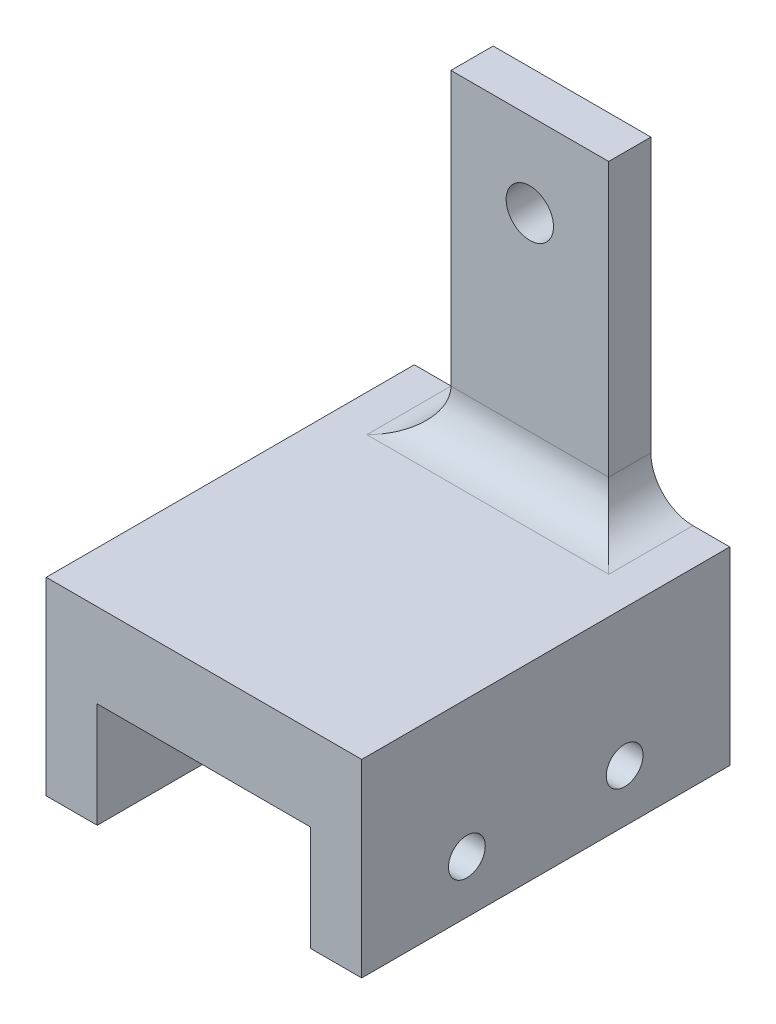
ISO-10303-21;
HEADER;
FILE_DESCRIPTION(('STEP AP214'),'2;1');
FILE_NAME('part.step','',(''),(''),'','','');
FILE_SCHEMA(('AUTOMOTIVE_DESIGN { 1 0 10303 214 1 1 1 1 }'));
ENDSEC;
DATA;
#1=APPLICATION_CONTEXT('core data for automotive mechanical design processes');
#2=APPLICATION_PROTOCOL_DEFINITION('international standard','automotive_design',2000,#1);
#3=PRODUCT_CONTEXT('',#1,'mechanical');
#4=PRODUCT('Part','Part','',(#3));
#5=PRODUCT_RELATED_PRODUCT_CATEGORY('part','',(#4));
#6=PRODUCT_DEFINITION_FORMATION('','',#4);
#7=PRODUCT_DEFINITION_CONTEXT('part definition',#1,'design');
#8=PRODUCT_DEFINITION('design','',#6,#7);
#9=PRODUCT_DEFINITION_SHAPE('','',#8);
#10=(LENGTH_UNIT() NAMED_UNIT(*) SI_UNIT(.MILLI.,.METRE.));
#11=(NAMED_UNIT(*) PLANE_ANGLE_UNIT() SI_UNIT($,.RADIAN.));
#12=(NAMED_UNIT(*) SI_UNIT($,.STERADIAN.) SOLID_ANGLE_UNIT());
#13=UNCERTAINTY_MEASURE_WITH_UNIT(LENGTH_MEASURE(1.E-05),#10,'distance_accuracy_value','');
#14=(GEOMETRIC_REPRESENTATION_CONTEXT(3) GLOBAL_UNCERTAINTY_ASSIGNED_CONTEXT((#13)) GLOBAL_UNIT_ASSIGNED_CONTEXT((#10,
#11,#12)) REPRESENTATION_CONTEXT('',''));
#15=CARTESIAN_POINT('',(0.,0.,0.));
#16=DIRECTION('',(0.,0.,1.));
#17=DIRECTION('',(1.,0.,0.));
#18=AXIS2_PLACEMENT_3D('',#15,#16,#17);
#19=CARTESIAN_POINT('',(0.,-15.,0.));
#20=DIRECTION('',(0.,-1.,0.));
#21=DIRECTION('',(0.,0.,-1.));
#22=AXIS2_PLACEMENT_3D('',#19,#20,#21);
#23=PLANE('',#22);
#24=DIRECTION('',(1.,0.,0.));
#25=VECTOR('',#24,1.);
#26=CARTESIAN_POINT('',(-15.,-15.,0.));
#27=LINE('',#26,#25);
#28=CARTESIAN_POINT('',(11.5,-15.,0.));
#29=VERTEX_POINT('',#28);
#30=CARTESIAN_POINT('',(15.,-15.,0.));
#31=VERTEX_POINT('',#30);
#32=EDGE_CURVE('E159',#29,#31,#27,.T.);
#33=ORIENTED_EDGE('',*,*,#32,.F.);
#34=DIRECTION('',(0.,0.,-1.));
#35=VECTOR('',#34,1.);
#36=CARTESIAN_POINT('',(11.5,-15.,4.01600419213466));
#37=LINE('',#36,#35);
#38=CARTESIAN_POINT('',(11.5,-15.,8.01600419213466));
#39=VERTEX_POINT('',#38);
#40=EDGE_CURVE('E231',#29,#39,#37,.F.);
#41=ORIENTED_EDGE('',*,*,#40,.T.);
#42=DIRECTION('',(1.,0.,0.));
#43=VECTOR('',#42,1.);
#44=CARTESIAN_POINT('',(-7.5,-15.,8.01600419213466));
#45=LINE('',#44,#43);
#46=CARTESIAN_POINT('',(-11.5,-15.,8.01600419213466));
#47=VERTEX_POINT('',#46);
#48=EDGE_CURVE('E227',#39,#47,#45,.F.);
#49=ORIENTED_EDGE('',*,*,#48,.T.);
#50=DIRECTION('',(0.,0.,1.));
#51=VECTOR('',#50,1.);
#52=CARTESIAN_POINT('',(-11.5,-15.,0.));
#53=LINE('',#52,#51);
#54=CARTESIAN_POINT('',(-11.5,-15.,0.));
#55=VERTEX_POINT('',#54);
#56=EDGE_CURVE('E229',#47,#55,#53,.F.);
#57=ORIENTED_EDGE('',*,*,#56,.T.);
#58=CARTESIAN_POINT('',(-15.,-15.,0.));
#59=VERTEX_POINT('',#58);
#60=EDGE_CURVE('E161',#59,#55,#27,.T.);
#61=ORIENTED_EDGE('',*,*,#60,.F.);
#62=DIRECTION('',(0.,0.,-1.));
#63=VECTOR('',#62,1.);
#64=CARTESIAN_POINT('',(-15.,-15.,0.));
#65=LINE('',#64,#63);
#66=CARTESIAN_POINT('',(-15.,-15.,35.));
#67=VERTEX_POINT('',#66);
#68=EDGE_CURVE('E209',#67,#59,#65,.T.);
#69=ORIENTED_EDGE('',*,*,#68,.F.);
#70=DIRECTION('',(-1.,0.,0.));
#71=VECTOR('',#70,1.);
#72=CARTESIAN_POINT('',(15.,-15.,35.));
#73=LINE('',#72,#71);
#74=CARTESIAN_POINT('',(15.,-15.,35.));
#75=VERTEX_POINT('',#74);
#76=EDGE_CURVE('E213',#75,#67,#73,.T.);
#77=ORIENTED_EDGE('',*,*,#76,.F.);
#78=DIRECTION('',(0.,0.,1.));
#79=VECTOR('',#78,1.);
#80=CARTESIAN_POINT('',(15.,-15.,0.));
#81=LINE('',#80,#79);
#82=EDGE_CURVE('E205',#31,#75,#81,.T.);
#83=ORIENTED_EDGE('',*,*,#82,.F.);
#84=EDGE_LOOP('',(#33,#41,#49,#57,#61,#69,#77,#83));
#85=FACE_BOUND('',#84,.T.);
#86=ADVANCED_FACE('F33',(#85),#23,.F.);
#87=CARTESIAN_POINT('',(0.,-23.,0.));
#88=DIRECTION('',(0.,-1.,0.));
#89=DIRECTION('',(0.,0.,-1.));
#90=AXIS2_PLACEMENT_3D('',#87,#88,#89);
#91=PLANE('',#90);
#92=DIRECTION('',(1.,0.,0.));
#93=VECTOR('',#92,1.);
#94=CARTESIAN_POINT('',(15.,-23.,0.));
#95=LINE('',#94,#93);
#96=CARTESIAN_POINT('',(-10.15,-23.,0.));
#97=VERTEX_POINT('',#96);
#98=CARTESIAN_POINT('',(10.15,-23.,0.));
#99=VERTEX_POINT('',#98);
#100=EDGE_CURVE('E208',#97,#99,#95,.T.);
#101=ORIENTED_EDGE('',*,*,#100,.T.);
#102=DIRECTION('',(0.,0.,-1.));
#103=VECTOR('',#102,1.);
#104=CARTESIAN_POINT('',(10.15,-23.,0.));
#105=LINE('',#104,#103);
#106=CARTESIAN_POINT('',(10.15,-23.,35.));
#107=VERTEX_POINT('',#106);
#108=EDGE_CURVE('E167',#107,#99,#105,.T.);
#109=ORIENTED_EDGE('',*,*,#108,.F.);
#110=DIRECTION('',(-1.,0.,0.));
#111=VECTOR('',#110,1.);
#112=CARTESIAN_POINT('',(15.,-23.,35.));
#113=LINE('',#112,#111);
#114=CARTESIAN_POINT('',(-10.15,-23.,35.));
#115=VERTEX_POINT('',#114);
#116=EDGE_CURVE('E206',#107,#115,#113,.T.);
#117=ORIENTED_EDGE('',*,*,#116,.T.);
#118=DIRECTION('',(0.,0.,1.));
#119=VECTOR('',#118,1.);
#120=CARTESIAN_POINT('',(-10.15,-23.,0.));
#121=LINE('',#120,#119);
#122=EDGE_CURVE('E186',#97,#115,#121,.T.);
#123=ORIENTED_EDGE('',*,*,#122,.F.);
#124=EDGE_LOOP('',(#101,#109,#117,#123));
#125=FACE_BOUND('',#124,.T.);
#126=ADVANCED_FACE('F317',(#125),#91,.T.);
#127=CARTESIAN_POINT('',(15.,-15.,7.));
#128=DIRECTION('',(-1.,0.,0.));
#129=DIRECTION('',(0.,0.,1.));
#130=AXIS2_PLACEMENT_3D('',#127,#128,#129);
#131=PLANE('',#130);
#132=CARTESIAN_POINT('',(15.,-28.,25.));
#133=DIRECTION('',(1.,0.,0.));
#134=DIRECTION('',(0.,0.,-1.));
#135=AXIS2_PLACEMENT_3D('',#132,#133,#134);
#136=CIRCLE('',#135,1.75);
#137=CARTESIAN_POINT('',(15.,-28.,23.25));
#138=VERTEX_POINT('',#137);
#139=EDGE_CURVE('E557',#138,#138,#136,.T.);
#140=ORIENTED_EDGE('',*,*,#139,.F.);
#141=EDGE_LOOP('',(#140));
#142=FACE_BOUND('',#141,.T.);
#143=CARTESIAN_POINT('',(15.,-28.,10.));
#144=DIRECTION('',(1.,0.,0.));
#145=DIRECTION('',(0.,0.,-1.));
#146=AXIS2_PLACEMENT_3D('',#143,#144,#145);
#147=CIRCLE('',#146,1.75);
#148=CARTESIAN_POINT('',(15.,-28.,8.25));
#149=VERTEX_POINT('',#148);
#150=EDGE_CURVE('E252',#149,#149,#147,.T.);
#151=ORIENTED_EDGE('',*,*,#150,.F.);
#152=EDGE_LOOP('',(#151));
#153=FACE_BOUND('',#152,.T.);
#154=DIRECTION('',(0.,1.,0.));
#155=VECTOR('',#154,1.);
#156=CARTESIAN_POINT('',(15.,-15.,0.));
#157=LINE('',#156,#155);
#158=CARTESIAN_POINT('',(15.,-33.,0.));
#159=VERTEX_POINT('',#158);
#160=EDGE_CURVE('E221',#159,#31,#157,.T.);
#161=ORIENTED_EDGE('',*,*,#160,.T.);
#162=ORIENTED_EDGE('',*,*,#82,.T.);
#163=DIRECTION('',(0.,1.,0.));
#164=VECTOR('',#163,1.);
#165=CARTESIAN_POINT('',(15.,-23.,35.));
#166=LINE('',#165,#164);
#167=CARTESIAN_POINT('',(15.,-33.,35.));
#168=VERTEX_POINT('',#167);
#169=EDGE_CURVE('E218',#168,#75,#166,.T.);
#170=ORIENTED_EDGE('',*,*,#169,.F.);
#171=DIRECTION('',(0.,0.,1.));
#172=VECTOR('',#171,1.);
#173=CARTESIAN_POINT('',(15.,-33.,0.));
#174=LINE('',#173,#172);
#175=EDGE_CURVE('E168',#159,#168,#174,.T.);
#176=ORIENTED_EDGE('',*,*,#175,.F.);
#177=EDGE_LOOP('',(#161,#162,#170,#176));
#178=FACE_BOUND('',#177,.T.);
#179=ADVANCED_FACE('F288',(#142,#153,#178),#131,.F.);
#180=CARTESIAN_POINT('',(-15.,-15.,7.));
#181=DIRECTION('',(1.,0.,0.));
#182=DIRECTION('',(0.,0.,-1.));
#183=AXIS2_PLACEMENT_3D('',#180,#181,#182);
#184=PLANE('',#183);
#185=CARTESIAN_POINT('',(-15.,-28.,25.));
#186=DIRECTION('',(1.,0.,0.));
#187=DIRECTION('',(0.,0.,-1.));
#188=AXIS2_PLACEMENT_3D('',#185,#186,#187);
#189=CIRCLE('',#188,1.75);
#190=CARTESIAN_POINT('',(-15.,-28.,23.25));
#191=VERTEX_POINT('',#190);
#192=EDGE_CURVE('E553',#191,#191,#189,.T.);
#193=ORIENTED_EDGE('',*,*,#192,.T.);
#194=EDGE_LOOP('',(#193));
#195=FACE_BOUND('',#194,.T.);
#196=CARTESIAN_POINT('',(-15.,-28.,10.));
#197=DIRECTION('',(1.,0.,0.));
#198=DIRECTION('',(0.,0.,-1.));
#199=AXIS2_PLACEMENT_3D('',#196,#197,#198);
#200=CIRCLE('',#199,1.75);
#201=CARTESIAN_POINT('',(-15.,-28.,8.25));
#202=VERTEX_POINT('',#201);
#203=EDGE_CURVE('E246',#202,#202,#200,.T.);
#204=ORIENTED_EDGE('',*,*,#203,.T.);
#205=EDGE_LOOP('',(#204));
#206=FACE_BOUND('',#205,.T.);
#207=ORIENTED_EDGE('',*,*,#68,.T.);
#208=DIRECTION('',(0.,-1.,0.));
#209=VECTOR('',#208,1.);
#210=CARTESIAN_POINT('',(-15.,-15.,0.));
#211=LINE('',#210,#209);
#212=CARTESIAN_POINT('',(-15.,-33.,0.));
#213=VERTEX_POINT('',#212);
#214=EDGE_CURVE('E224',#59,#213,#211,.T.);
#215=ORIENTED_EDGE('',*,*,#214,.T.);
#216=DIRECTION('',(0.,0.,-1.));
#217=VECTOR('',#216,1.);
#218=CARTESIAN_POINT('',(-15.,-33.,0.));
#219=LINE('',#218,#217);
#220=CARTESIAN_POINT('',(-15.,-33.,35.));
#221=VERTEX_POINT('',#220);
#222=EDGE_CURVE('E187',#221,#213,#219,.T.);
#223=ORIENTED_EDGE('',*,*,#222,.F.);
#224=DIRECTION('',(0.,1.,0.));
#225=VECTOR('',#224,1.);
#226=CARTESIAN_POINT('',(-15.,-23.,35.));
#227=LINE('',#226,#225);
#228=EDGE_CURVE('E211',#221,#67,#227,.T.);
#229=ORIENTED_EDGE('',*,*,#228,.T.);
#230=EDGE_LOOP('',(#207,#215,#223,#229));
#231=FACE_BOUND('',#230,.T.);
#232=ADVANCED_FACE('F313',(#195,#206,#231),#184,.F.);
#233=CARTESIAN_POINT('',(0.,0.,0.));
#234=DIRECTION('',(0.,0.,-1.));
#235=DIRECTION('',(-1.,0.,0.));
#236=AXIS2_PLACEMENT_3D('',#233,#234,#235);
#237=PLANE('',#236);
#238=CARTESIAN_POINT('',(0.,7.,0.));
#239=DIRECTION('',(0.,0.,-1.));
#240=DIRECTION('',(-1.,0.,0.));
#241=AXIS2_PLACEMENT_3D('',#238,#239,#240);
#242=CIRCLE('',#241,2.25);
#243=CARTESIAN_POINT('',(-2.25,7.,0.));
#244=VERTEX_POINT('',#243);
#245=EDGE_CURVE('E243',#244,#244,#242,.F.);
#246=ORIENTED_EDGE('',*,*,#245,.T.);
#247=EDGE_LOOP('',(#246));
#248=FACE_BOUND('',#247,.T.);
#249=ORIENTED_EDGE('',*,*,#60,.T.);
#250=CARTESIAN_POINT('',(-11.5,-11.,0.));
#251=DIRECTION('',(0.,0.,-1.));
#252=DIRECTION('',(-1.,0.,0.));
#253=AXIS2_PLACEMENT_3D('',#250,#251,#252);
#254=CIRCLE('',#253,4.);
#255=CARTESIAN_POINT('',(-7.5,-11.,0.));
#256=VERTEX_POINT('',#255);
#257=EDGE_CURVE('E11',#55,#256,#254,.F.);
#258=ORIENTED_EDGE('',*,*,#257,.T.);
#259=DIRECTION('',(0.,-1.,0.));
#260=VECTOR('',#259,1.);
#261=CARTESIAN_POINT('',(-7.5,15.,0.));
#262=LINE('',#261,#260);
#263=CARTESIAN_POINT('',(-7.5,15.,0.));
#264=VERTEX_POINT('',#263);
#265=EDGE_CURVE('E140',#264,#256,#262,.T.);
#266=ORIENTED_EDGE('',*,*,#265,.F.);
#267=DIRECTION('',(-1.,0.,0.));
#268=VECTOR('',#267,1.);
#269=CARTESIAN_POINT('',(-7.5,15.,0.));
#270=LINE('',#269,#268);
#271=CARTESIAN_POINT('',(7.5,15.,0.));
#272=VERTEX_POINT('',#271);
#273=EDGE_CURVE('E135',#272,#264,#270,.T.);
#274=ORIENTED_EDGE('',*,*,#273,.F.);
#275=DIRECTION('',(0.,-1.,0.));
#276=VECTOR('',#275,1.);
#277=CARTESIAN_POINT('',(7.5,15.,0.));
#278=LINE('',#277,#276);
#279=CARTESIAN_POINT('',(7.5,-11.,0.));
#280=VERTEX_POINT('',#279);
#281=EDGE_CURVE('E139',#272,#280,#278,.T.);
#282=ORIENTED_EDGE('',*,*,#281,.T.);
#283=CARTESIAN_POINT('',(11.5,-11.,0.));
#284=DIRECTION('',(0.,0.,-1.));
#285=DIRECTION('',(-1.,0.,0.));
#286=AXIS2_PLACEMENT_3D('',#283,#284,#285);
#287=CIRCLE('',#286,4.);
#288=EDGE_CURVE('E42',#280,#29,#287,.F.);
#289=ORIENTED_EDGE('',*,*,#288,.T.);
#290=ORIENTED_EDGE('',*,*,#32,.T.);
#291=ORIENTED_EDGE('',*,*,#160,.F.);
#292=DIRECTION('',(1.,0.,0.));
#293=VECTOR('',#292,1.);
#294=CARTESIAN_POINT('',(15.,-33.,0.));
#295=LINE('',#294,#293);
#296=CARTESIAN_POINT('',(10.15,-33.,0.));
#297=VERTEX_POINT('',#296);
#298=EDGE_CURVE('E175',#297,#159,#295,.T.);
#299=ORIENTED_EDGE('',*,*,#298,.F.);
#300=DIRECTION('',(0.,1.,0.));
#301=VECTOR('',#300,1.);
#302=CARTESIAN_POINT('',(10.15,-33.,0.));
#303=LINE('',#302,#301);
#304=EDGE_CURVE('E178',#297,#99,#303,.T.);
#305=ORIENTED_EDGE('',*,*,#304,.T.);
#306=ORIENTED_EDGE('',*,*,#100,.F.);
#307=DIRECTION('',(0.,1.,0.));
#308=VECTOR('',#307,1.);
#309=CARTESIAN_POINT('',(-10.15,-33.,0.));
#310=LINE('',#309,#308);
#311=CARTESIAN_POINT('',(-10.15,-33.,0.));
#312=VERTEX_POINT('',#311);
#313=EDGE_CURVE('E202',#312,#97,#310,.T.);
#314=ORIENTED_EDGE('',*,*,#313,.F.);
#315=DIRECTION('',(1.,0.,0.));
#316=VECTOR('',#315,1.);
#317=CARTESIAN_POINT('',(-15.,-33.,0.));
#318=LINE('',#317,#316);
#319=EDGE_CURVE('E190',#213,#312,#318,.T.);
#320=ORIENTED_EDGE('',*,*,#319,.F.);
#321=ORIENTED_EDGE('',*,*,#214,.F.);
#322=EDGE_LOOP('',(#249,#258,#266,#274,#282,#289,#290,#291,#299,#305,#306,#314,#320,#321));
#323=FACE_BOUND('',#322,.T.);
#324=ADVANCED_FACE('F137',(#248,#323),#237,.T.);
#325=CARTESIAN_POINT('',(15.,-23.,35.));
#326=DIRECTION('',(0.,0.,-1.));
#327=DIRECTION('',(-1.,0.,0.));
#328=AXIS2_PLACEMENT_3D('',#325,#326,#327);
#329=PLANE('',#328);
#330=ORIENTED_EDGE('',*,*,#76,.T.);
#331=ORIENTED_EDGE('',*,*,#228,.F.);
#332=DIRECTION('',(-1.,0.,0.));
#333=VECTOR('',#332,1.);
#334=CARTESIAN_POINT('',(-15.,-33.,35.));
#335=LINE('',#334,#333);
#336=CARTESIAN_POINT('',(-10.15,-33.,35.));
#337=VERTEX_POINT('',#336);
#338=EDGE_CURVE('E194',#337,#221,#335,.T.);
#339=ORIENTED_EDGE('',*,*,#338,.F.);
#340=DIRECTION('',(0.,1.,0.));
#341=VECTOR('',#340,1.);
#342=CARTESIAN_POINT('',(-10.15,-33.,35.));
#343=LINE('',#342,#341);
#344=EDGE_CURVE('E197',#337,#115,#343,.T.);
#345=ORIENTED_EDGE('',*,*,#344,.T.);
#346=ORIENTED_EDGE('',*,*,#116,.F.);
#347=DIRECTION('',(0.,1.,0.));
#348=VECTOR('',#347,1.);
#349=CARTESIAN_POINT('',(10.15,-33.,35.));
#350=LINE('',#349,#348);
#351=CARTESIAN_POINT('',(10.15,-33.,35.));
#352=VERTEX_POINT('',#351);
#353=EDGE_CURVE('E183',#352,#107,#350,.T.);
#354=ORIENTED_EDGE('',*,*,#353,.F.);
#355=DIRECTION('',(-1.,0.,0.));
#356=VECTOR('',#355,1.);
#357=CARTESIAN_POINT('',(15.,-33.,35.));
#358=LINE('',#357,#356);
#359=EDGE_CURVE('E171',#168,#352,#358,.T.);
#360=ORIENTED_EDGE('',*,*,#359,.F.);
#361=ORIENTED_EDGE('',*,*,#169,.T.);
#362=EDGE_LOOP('',(#330,#331,#339,#345,#346,#354,#360,#361));
#363=FACE_BOUND('',#362,.T.);
#364=ADVANCED_FACE('F315',(#363),#329,.F.);
#365=CARTESIAN_POINT('',(-10.15,-33.,0.));
#366=DIRECTION('',(-1.,0.,0.));
#367=DIRECTION('',(0.,0.,1.));
#368=AXIS2_PLACEMENT_3D('',#365,#366,#367);
#369=PLANE('',#368);
#370=CARTESIAN_POINT('',(-10.15,-28.,25.));
#371=DIRECTION('',(-1.,0.,0.));
#372=DIRECTION('',(0.,0.,1.));
#373=AXIS2_PLACEMENT_3D('',#370,#371,#372);
#374=CIRCLE('',#373,1.75);
#375=CARTESIAN_POINT('',(-10.15,-28.,26.75));
#376=VERTEX_POINT('',#375);
#377=EDGE_CURVE('E257',#376,#376,#374,.T.);
#378=ORIENTED_EDGE('',*,*,#377,.T.);
#379=EDGE_LOOP('',(#378));
#380=FACE_BOUND('',#379,.T.);
#381=CARTESIAN_POINT('',(-10.15,-28.,10.));
#382=DIRECTION('',(-1.,0.,0.));
#383=DIRECTION('',(0.,0.,1.));
#384=AXIS2_PLACEMENT_3D('',#381,#382,#383);
#385=CIRCLE('',#384,1.75);
#386=CARTESIAN_POINT('',(-10.15,-28.,11.75));
#387=VERTEX_POINT('',#386);
#388=EDGE_CURVE('E241',#387,#387,#385,.T.);
#389=ORIENTED_EDGE('',*,*,#388,.T.);
#390=EDGE_LOOP('',(#389));
#391=FACE_BOUND('',#390,.T.);
#392=ORIENTED_EDGE('',*,*,#122,.T.);
#393=ORIENTED_EDGE('',*,*,#344,.F.);
#394=DIRECTION('',(0.,0.,1.));
#395=VECTOR('',#394,1.);
#396=CARTESIAN_POINT('',(-10.15,-33.,0.));
#397=LINE('',#396,#395);
#398=EDGE_CURVE('E192',#312,#337,#397,.T.);
#399=ORIENTED_EDGE('',*,*,#398,.F.);
#400=ORIENTED_EDGE('',*,*,#313,.T.);
#401=EDGE_LOOP('',(#392,#393,#399,#400));
#402=FACE_BOUND('',#401,.T.);
#403=ADVANCED_FACE('F304',(#380,#391,#402),#369,.F.);
#404=CARTESIAN_POINT('',(0.,-33.,0.));
#405=DIRECTION('',(0.,1.,0.));
#406=DIRECTION('',(0.,0.,1.));
#407=AXIS2_PLACEMENT_3D('',#404,#405,#406);
#408=PLANE('',#407);
#409=ORIENTED_EDGE('',*,*,#222,.T.);
#410=ORIENTED_EDGE('',*,*,#319,.T.);
#411=ORIENTED_EDGE('',*,*,#398,.T.);
#412=ORIENTED_EDGE('',*,*,#338,.T.);
#413=EDGE_LOOP('',(#409,#410,#411,#412));
#414=FACE_BOUND('',#413,.T.);
#415=ADVANCED_FACE('F308',(#414),#408,.F.);
#416=CARTESIAN_POINT('',(10.15,-33.,0.));
#417=DIRECTION('',(1.,0.,0.));
#418=DIRECTION('',(0.,0.,-1.));
#419=AXIS2_PLACEMENT_3D('',#416,#417,#418);
#420=PLANE('',#419);
#421=CARTESIAN_POINT('',(10.15,-28.,25.));
#422=DIRECTION('',(1.,0.,0.));
#423=DIRECTION('',(0.,0.,-1.));
#424=AXIS2_PLACEMENT_3D('',#421,#422,#423);
#425=CIRCLE('',#424,1.75);
#426=CARTESIAN_POINT('',(10.15,-28.,23.25));
#427=VERTEX_POINT('',#426);
#428=EDGE_CURVE('E37',#427,#427,#425,.T.);
#429=ORIENTED_EDGE('',*,*,#428,.T.);
#430=EDGE_LOOP('',(#429));
#431=FACE_BOUND('',#430,.T.);
#432=CARTESIAN_POINT('',(10.15,-28.,10.));
#433=DIRECTION('',(1.,0.,0.));
#434=DIRECTION('',(0.,0.,-1.));
#435=AXIS2_PLACEMENT_3D('',#432,#433,#434);
#436=CIRCLE('',#435,1.75);
#437=CARTESIAN_POINT('',(10.15,-28.,8.25));
#438=VERTEX_POINT('',#437);
#439=EDGE_CURVE('E244',#438,#438,#436,.T.);
#440=ORIENTED_EDGE('',*,*,#439,.T.);
#441=EDGE_LOOP('',(#440));
#442=FACE_BOUND('',#441,.T.);
#443=ORIENTED_EDGE('',*,*,#108,.T.);
#444=ORIENTED_EDGE('',*,*,#304,.F.);
#445=DIRECTION('',(0.,0.,-1.));
#446=VECTOR('',#445,1.);
#447=CARTESIAN_POINT('',(10.15,-33.,0.));
#448=LINE('',#447,#446);
#449=EDGE_CURVE('E173',#352,#297,#448,.T.);
#450=ORIENTED_EDGE('',*,*,#449,.F.);
#451=ORIENTED_EDGE('',*,*,#353,.T.);
#452=EDGE_LOOP('',(#443,#444,#450,#451));
#453=FACE_BOUND('',#452,.T.);
#454=ADVANCED_FACE('F297',(#431,#442,#453),#420,.F.);
#455=CARTESIAN_POINT('',(0.,-33.,0.));
#456=DIRECTION('',(0.,-1.,0.));
#457=DIRECTION('',(0.,0.,-1.));
#458=AXIS2_PLACEMENT_3D('',#455,#456,#457);
#459=PLANE('',#458);
#460=ORIENTED_EDGE('',*,*,#175,.T.);
#461=ORIENTED_EDGE('',*,*,#359,.T.);
#462=ORIENTED_EDGE('',*,*,#449,.T.);
#463=ORIENTED_EDGE('',*,*,#298,.T.);
#464=EDGE_LOOP('',(#460,#461,#462,#463));
#465=FACE_BOUND('',#464,.T.);
#466=ADVANCED_FACE('F291',(#465),#459,.T.);
#467=CARTESIAN_POINT('',(7.5,15.,0.));
#468=DIRECTION('',(-1.,0.,0.));
#469=DIRECTION('',(0.,0.,1.));
#470=AXIS2_PLACEMENT_3D('',#467,#468,#469);
#471=PLANE('',#470);
#472=DIRECTION('',(0.,-1.,0.));
#473=VECTOR('',#472,1.);
#474=CARTESIAN_POINT('',(7.5,15.,4.01600419213466));
#475=LINE('',#474,#473);
#476=CARTESIAN_POINT('',(7.5,15.,4.01600419213466));
#477=VERTEX_POINT('',#476);
#478=CARTESIAN_POINT('',(7.5,-11.,4.01600419213466));
#479=VERTEX_POINT('',#478);
#480=EDGE_CURVE('E267',#477,#479,#475,.T.);
#481=ORIENTED_EDGE('',*,*,#480,.T.);
#482=DIRECTION('',(0.,0.,-1.));
#483=VECTOR('',#482,1.);
#484=CARTESIAN_POINT('',(7.5,-11.,0.));
#485=LINE('',#484,#483);
#486=EDGE_CURVE('E158',#479,#280,#485,.T.);
#487=ORIENTED_EDGE('',*,*,#486,.T.);
#488=ORIENTED_EDGE('',*,*,#281,.F.);
#489=DIRECTION('',(0.,0.,-1.));
#490=VECTOR('',#489,1.);
#491=CARTESIAN_POINT('',(7.5,15.,0.));
#492=LINE('',#491,#490);
#493=EDGE_CURVE('E144',#477,#272,#492,.T.);
#494=ORIENTED_EDGE('',*,*,#493,.F.);
#495=EDGE_LOOP('',(#481,#487,#488,#494));
#496=FACE_BOUND('',#495,.T.);
#497=ADVANCED_FACE('F156',(#496),#471,.F.);
#498=CARTESIAN_POINT('',(-7.5,15.,0.));
#499=DIRECTION('',(1.,0.,0.));
#500=DIRECTION('',(0.,0.,-1.));
#501=AXIS2_PLACEMENT_3D('',#498,#499,#500);
#502=PLANE('',#501);
#503=ORIENTED_EDGE('',*,*,#265,.T.);
#504=DIRECTION('',(0.,0.,1.));
#505=VECTOR('',#504,1.);
#506=CARTESIAN_POINT('',(-7.5,-11.,4.01600419213466));
#507=LINE('',#506,#505);
#508=CARTESIAN_POINT('',(-7.5,-11.,4.01600419213466));
#509=VERTEX_POINT('',#508);
#510=EDGE_CURVE('E55',#256,#509,#507,.T.);
#511=ORIENTED_EDGE('',*,*,#510,.T.);
#512=DIRECTION('',(0.,-1.,0.));
#513=VECTOR('',#512,1.);
#514=CARTESIAN_POINT('',(-7.5,15.,4.01600419213466));
#515=LINE('',#514,#513);
#516=CARTESIAN_POINT('',(-7.5,15.,4.01600419213466));
#517=VERTEX_POINT('',#516);
#518=EDGE_CURVE('E163',#517,#509,#515,.T.);
#519=ORIENTED_EDGE('',*,*,#518,.F.);
#520=DIRECTION('',(0.,0.,1.));
#521=VECTOR('',#520,1.);
#522=CARTESIAN_POINT('',(-7.5,15.,0.));
#523=LINE('',#522,#521);
#524=EDGE_CURVE('E143',#264,#517,#523,.T.);
#525=ORIENTED_EDGE('',*,*,#524,.F.);
#526=EDGE_LOOP('',(#503,#511,#519,#525));
#527=FACE_BOUND('',#526,.T.);
#528=ADVANCED_FACE('F362',(#527),#502,.F.);
#529=CARTESIAN_POINT('',(-7.5,15.,4.01600419213466));
#530=DIRECTION('',(0.,0.,-1.));
#531=DIRECTION('',(-1.,0.,0.));
#532=AXIS2_PLACEMENT_3D('',#529,#530,#531);
#533=PLANE('',#532);
#534=CARTESIAN_POINT('',(0.,7.,4.01600419213466));
#535=DIRECTION('',(0.,0.,1.));
#536=DIRECTION('',(1.,0.,0.));
#537=AXIS2_PLACEMENT_3D('',#534,#535,#536);
#538=CIRCLE('',#537,2.25);
#539=CARTESIAN_POINT('',(2.25,7.,4.01600419213466));
#540=VERTEX_POINT('',#539);
#541=EDGE_CURVE('E153',#540,#540,#538,.T.);
#542=ORIENTED_EDGE('',*,*,#541,.F.);
#543=EDGE_LOOP('',(#542));
#544=FACE_BOUND('',#543,.T.);
#545=ORIENTED_EDGE('',*,*,#518,.T.);
#546=DIRECTION('',(1.,0.,0.));
#547=VECTOR('',#546,1.);
#548=CARTESIAN_POINT('',(7.5,-11.,4.01600419213466));
#549=LINE('',#548,#547);
#550=EDGE_CURVE('E234',#509,#479,#549,.T.);
#551=ORIENTED_EDGE('',*,*,#550,.T.);
#552=ORIENTED_EDGE('',*,*,#480,.F.);
#553=DIRECTION('',(1.,0.,0.));
#554=VECTOR('',#553,1.);
#555=CARTESIAN_POINT('',(-7.5,15.,4.01600419213466));
#556=LINE('',#555,#554);
#557=EDGE_CURVE('E149',#517,#477,#556,.T.);
#558=ORIENTED_EDGE('',*,*,#557,.F.);
#559=EDGE_LOOP('',(#545,#551,#552,#558));
#560=FACE_BOUND('',#559,.T.);
#561=ADVANCED_FACE('F270',(#544,#560),#533,.F.);
#562=CARTESIAN_POINT('',(0.,15.,0.));
#563=DIRECTION('',(0.,1.,0.));
#564=DIRECTION('',(0.,0.,1.));
#565=AXIS2_PLACEMENT_3D('',#562,#563,#564);
#566=PLANE('',#565);
#567=ORIENTED_EDGE('',*,*,#493,.T.);
#568=ORIENTED_EDGE('',*,*,#273,.T.);
#569=ORIENTED_EDGE('',*,*,#524,.T.);
#570=ORIENTED_EDGE('',*,*,#557,.T.);
#571=EDGE_LOOP('',(#567,#568,#569,#570));
#572=FACE_BOUND('',#571,.T.);
#573=ADVANCED_FACE('F147',(#572),#566,.T.);
#574=CARTESIAN_POINT('',(0.,7.,-0.00100000000000013));
#575=DIRECTION('',(0.,0.,1.));
#576=DIRECTION('',(1.,0.,0.));
#577=AXIS2_PLACEMENT_3D('',#574,#575,#576);
#578=CYLINDRICAL_SURFACE('',#577,2.25);
#579=ORIENTED_EDGE('',*,*,#245,.F.);
#580=EDGE_LOOP('',(#579));
#581=FACE_BOUND('',#580,.T.);
#582=ORIENTED_EDGE('',*,*,#541,.T.);
#583=EDGE_LOOP('',(#582));
#584=FACE_BOUND('',#583,.T.);
#585=ADVANCED_FACE('F344',(#581,#584),#578,.F.);
#586=CARTESIAN_POINT('',(-11.5,-11.,0.));
#587=DIRECTION('',(0.,0.,-1.));
#588=DIRECTION('',(-1.,0.,0.));
#589=AXIS2_PLACEMENT_3D('',#586,#587,#588);
#590=CYLINDRICAL_SURFACE('',#589,4.);
#591=ORIENTED_EDGE('',*,*,#257,.F.);
#592=ORIENTED_EDGE('',*,*,#56,.F.);
#593=CARTESIAN_POINT('',(-11.5,-11.,8.01600419213466));
#594=DIRECTION('',(-0.707106781186548,0.,-0.707106781186547));
#595=DIRECTION('',(-0.707106781186547,0.,0.707106781186548));
#596=AXIS2_PLACEMENT_3D('',#593,#594,#595);
#597=ELLIPSE('',#596,5.65685424949238,4.);
#598=EDGE_CURVE('E240',#509,#47,#597,.T.);
#599=ORIENTED_EDGE('',*,*,#598,.F.);
#600=ORIENTED_EDGE('',*,*,#510,.F.);
#601=EDGE_LOOP('',(#591,#592,#599,#600));
#602=FACE_BOUND('',#601,.T.);
#603=ADVANCED_FACE('F35',(#602),#590,.F.);
#604=CARTESIAN_POINT('',(-7.5,-11.,8.01600419213466));
#605=DIRECTION('',(-1.,0.,0.));
#606=DIRECTION('',(0.,0.,1.));
#607=AXIS2_PLACEMENT_3D('',#604,#605,#606);
#608=CYLINDRICAL_SURFACE('',#607,4.);
#609=ORIENTED_EDGE('',*,*,#598,.T.);
#610=ORIENTED_EDGE('',*,*,#48,.F.);
#611=CARTESIAN_POINT('',(11.5,-11.,8.01600419213466));
#612=DIRECTION('',(-0.707106781186547,0.,0.707106781186548));
#613=DIRECTION('',(-0.707106781186548,0.,-0.707106781186547));
#614=AXIS2_PLACEMENT_3D('',#611,#612,#613);
#615=ELLIPSE('',#614,5.65685424949238,4.);
#616=EDGE_CURVE('E237',#479,#39,#615,.T.);
#617=ORIENTED_EDGE('',*,*,#616,.F.);
#618=ORIENTED_EDGE('',*,*,#550,.F.);
#619=EDGE_LOOP('',(#609,#610,#617,#618));
#620=FACE_BOUND('',#619,.T.);
#621=ADVANCED_FACE('F277',(#620),#608,.F.);
#622=CARTESIAN_POINT('',(11.5,-11.,0.));
#623=DIRECTION('',(0.,0.,1.));
#624=DIRECTION('',(1.,0.,0.));
#625=AXIS2_PLACEMENT_3D('',#622,#623,#624);
#626=CYLINDRICAL_SURFACE('',#625,4.);
#627=ORIENTED_EDGE('',*,*,#616,.T.);
#628=ORIENTED_EDGE('',*,*,#40,.F.);
#629=ORIENTED_EDGE('',*,*,#288,.F.);
#630=ORIENTED_EDGE('',*,*,#486,.F.);
#631=EDGE_LOOP('',(#627,#628,#629,#630));
#632=FACE_BOUND('',#631,.T.);
#633=ADVANCED_FACE('F280',(#632),#626,.F.);
#634=CARTESIAN_POINT('',(-15.,-28.,10.));
#635=DIRECTION('',(1.,0.,0.));
#636=DIRECTION('',(0.,0.,-1.));
#637=AXIS2_PLACEMENT_3D('',#634,#635,#636);
#638=CYLINDRICAL_SURFACE('',#637,1.75);
#639=ORIENTED_EDGE('',*,*,#150,.T.);
#640=EDGE_LOOP('',(#639));
#641=FACE_BOUND('',#640,.T.);
#642=ORIENTED_EDGE('',*,*,#439,.F.);
#643=EDGE_LOOP('',(#642));
#644=FACE_BOUND('',#643,.T.);
#645=ADVANCED_FACE('F339',(#641,#644),#638,.F.);
#646=ORIENTED_EDGE('',*,*,#203,.F.);
#647=EDGE_LOOP('',(#646));
#648=FACE_BOUND('',#647,.T.);
#649=ORIENTED_EDGE('',*,*,#388,.F.);
#650=EDGE_LOOP('',(#649));
#651=FACE_BOUND('',#650,.T.);
#652=ADVANCED_FACE('F357',(#648,#651),#638,.F.);
#653=CARTESIAN_POINT('',(-15.,-28.,25.));
#654=DIRECTION('',(1.,0.,0.));
#655=DIRECTION('',(0.,0.,-1.));
#656=AXIS2_PLACEMENT_3D('',#653,#654,#655);
#657=CYLINDRICAL_SURFACE('',#656,1.75);
#658=ORIENTED_EDGE('',*,*,#139,.T.);
#659=EDGE_LOOP('',(#658));
#660=FACE_BOUND('',#659,.T.);
#661=ORIENTED_EDGE('',*,*,#428,.F.);
#662=EDGE_LOOP('',(#661));
#663=FACE_BOUND('',#662,.T.);
#664=ADVANCED_FACE('F385',(#660,#663),#657,.F.);
#665=ORIENTED_EDGE('',*,*,#192,.F.);
#666=EDGE_LOOP('',(#665));
#667=FACE_BOUND('',#666,.T.);
#668=ORIENTED_EDGE('',*,*,#377,.F.);
#669=EDGE_LOOP('',(#668));
#670=FACE_BOUND('',#669,.T.);
#671=ADVANCED_FACE('F391',(#667,#670),#657,.F.);
#672=CLOSED_SHELL('',(#86,#126,#179,#232,#324,#364,#403,#415,#454,#466,#497,#528,#561,#573,#585,
#603,#621,#633,#645,#652,#664,#671));
#673=MANIFOLD_SOLID_BREP('B2',#672);
#674=ADVANCED_BREP_SHAPE_REPRESENTATION('',(#18,#673),#14);
#675=SHAPE_DEFINITION_REPRESENTATION(#9,#674);
ENDSEC;
END-ISO-10303-21;
